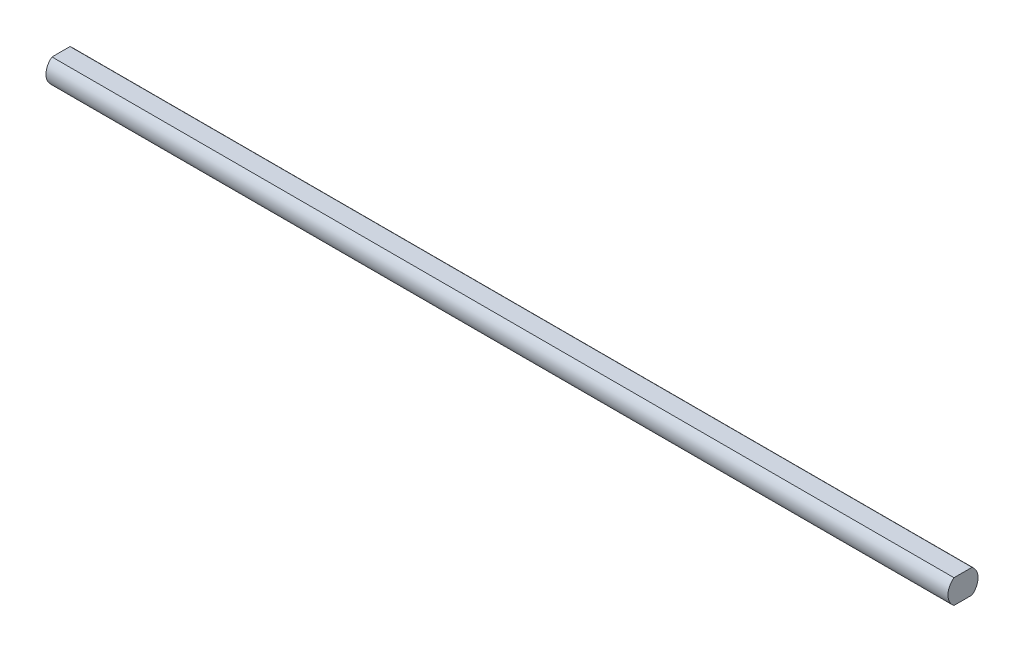
ISO-10303-21;
HEADER;
FILE_DESCRIPTION(('STEP AP214'),'2;1');
FILE_NAME('part.step','',(''),(''),'','','');
FILE_SCHEMA(('AUTOMOTIVE_DESIGN { 1 0 10303 214 1 1 1 1 }'));
ENDSEC;
DATA;
#1=APPLICATION_CONTEXT('core data for automotive mechanical design processes');
#2=APPLICATION_PROTOCOL_DEFINITION('international standard','automotive_design',2000,#1);
#3=PRODUCT_CONTEXT('',#1,'mechanical');
#4=PRODUCT('Part','Part','',(#3));
#5=PRODUCT_RELATED_PRODUCT_CATEGORY('part','',(#4));
#6=PRODUCT_DEFINITION_FORMATION('','',#4);
#7=PRODUCT_DEFINITION_CONTEXT('part definition',#1,'design');
#8=PRODUCT_DEFINITION('design','',#6,#7);
#9=PRODUCT_DEFINITION_SHAPE('','',#8);
#10=(LENGTH_UNIT() NAMED_UNIT(*) SI_UNIT(.MILLI.,.METRE.));
#11=(NAMED_UNIT(*) PLANE_ANGLE_UNIT() SI_UNIT($,.RADIAN.));
#12=(NAMED_UNIT(*) SI_UNIT($,.STERADIAN.) SOLID_ANGLE_UNIT());
#13=UNCERTAINTY_MEASURE_WITH_UNIT(LENGTH_MEASURE(1.E-05),#10,'distance_accuracy_value','');
#14=(GEOMETRIC_REPRESENTATION_CONTEXT(3) GLOBAL_UNCERTAINTY_ASSIGNED_CONTEXT((#13)) GLOBAL_UNIT_ASSIGNED_CONTEXT((#10,
#11,#12)) REPRESENTATION_CONTEXT('',''));
#15=CARTESIAN_POINT('',(0.,0.,0.));
#16=DIRECTION('',(0.,0.,1.));
#17=DIRECTION('',(1.,0.,0.));
#18=AXIS2_PLACEMENT_3D('',#15,#16,#17);
#19=CARTESIAN_POINT('',(-150.,-5.,0.));
#20=DIRECTION('',(-1.,0.,0.));
#21=DIRECTION('',(0.,0.,1.));
#22=AXIS2_PLACEMENT_3D('',#19,#20,#21);
#23=PLANE('',#22);
#24=CARTESIAN_POINT('',(-150.,0.,0.));
#25=DIRECTION('',(-1.,0.,0.));
#26=DIRECTION('',(0.,0.,1.));
#27=AXIS2_PLACEMENT_3D('',#24,#25,#26);
#28=CIRCLE('',#27,5.);
#29=CARTESIAN_POINT('',(-150.,4.,-3.));
#30=VERTEX_POINT('',#29);
#31=CARTESIAN_POINT('',(-150.,-4.00000000000002,-2.99999999999998));
#32=VERTEX_POINT('',#31);
#33=EDGE_CURVE('E106',#30,#32,#28,.T.);
#34=ORIENTED_EDGE('',*,*,#33,.T.);
#35=DIRECTION('',(0.,0.,-1.));
#36=VECTOR('',#35,1.);
#37=CARTESIAN_POINT('',(-150.,-4.00000000000002,0.));
#38=LINE('',#37,#36);
#39=CARTESIAN_POINT('',(-150.,-4.00000000000002,2.99999999999998));
#40=VERTEX_POINT('',#39);
#41=EDGE_CURVE('E62',#40,#32,#38,.T.);
#42=ORIENTED_EDGE('',*,*,#41,.F.);
#43=CARTESIAN_POINT('',(-150.,4.,3.));
#44=VERTEX_POINT('',#43);
#45=EDGE_CURVE('E102',#40,#44,#28,.T.);
#46=ORIENTED_EDGE('',*,*,#45,.T.);
#47=DIRECTION('',(0.,0.,-1.));
#48=VECTOR('',#47,1.);
#49=CARTESIAN_POINT('',(-150.,4.,3.));
#50=LINE('',#49,#48);
#51=EDGE_CURVE('E109',#44,#30,#50,.T.);
#52=ORIENTED_EDGE('',*,*,#51,.T.);
#53=EDGE_LOOP('',(#34,#42,#46,#52));
#54=FACE_BOUND('',#53,.T.);
#55=ADVANCED_FACE('F47',(#54),#23,.T.);
#56=CARTESIAN_POINT('',(150.,0.,0.));
#57=DIRECTION('',(1.,0.,0.));
#58=DIRECTION('',(0.,0.,-1.));
#59=AXIS2_PLACEMENT_3D('',#56,#57,#58);
#60=PLANE('',#59);
#61=CARTESIAN_POINT('',(150.,0.,0.));
#62=DIRECTION('',(-1.,0.,0.));
#63=DIRECTION('',(0.,0.,1.));
#64=AXIS2_PLACEMENT_3D('',#61,#62,#63);
#65=CIRCLE('',#64,5.);
#66=CARTESIAN_POINT('',(150.,-4.00000000000002,2.99999999999998));
#67=VERTEX_POINT('',#66);
#68=CARTESIAN_POINT('',(150.,4.,3.));
#69=VERTEX_POINT('',#68);
#70=EDGE_CURVE('E50',#67,#69,#65,.T.);
#71=ORIENTED_EDGE('',*,*,#70,.F.);
#72=DIRECTION('',(0.,0.,-1.));
#73=VECTOR('',#72,1.);
#74=CARTESIAN_POINT('',(150.,-4.00000000000002,0.));
#75=LINE('',#74,#73);
#76=CARTESIAN_POINT('',(150.,-4.00000000000002,-2.99999999999998));
#77=VERTEX_POINT('',#76);
#78=EDGE_CURVE('E88',#67,#77,#75,.T.);
#79=ORIENTED_EDGE('',*,*,#78,.T.);
#80=CARTESIAN_POINT('',(150.,4.,-3.));
#81=VERTEX_POINT('',#80);
#82=EDGE_CURVE('E11',#81,#77,#65,.T.);
#83=ORIENTED_EDGE('',*,*,#82,.F.);
#84=DIRECTION('',(0.,0.,-1.));
#85=VECTOR('',#84,1.);
#86=CARTESIAN_POINT('',(150.,4.,3.));
#87=LINE('',#86,#85);
#88=EDGE_CURVE('E70',#69,#81,#87,.T.);
#89=ORIENTED_EDGE('',*,*,#88,.F.);
#90=EDGE_LOOP('',(#71,#79,#83,#89));
#91=FACE_BOUND('',#90,.T.);
#92=ADVANCED_FACE('F99',(#91),#60,.T.);
#93=CARTESIAN_POINT('',(-150.,0.,0.));
#94=DIRECTION('',(-1.,0.,0.));
#95=DIRECTION('',(0.,0.,1.));
#96=AXIS2_PLACEMENT_3D('',#93,#94,#95);
#97=CYLINDRICAL_SURFACE('',#96,5.);
#98=ORIENTED_EDGE('',*,*,#45,.F.);
#99=DIRECTION('',(1.,0.,0.));
#100=VECTOR('',#99,1.);
#101=CARTESIAN_POINT('',(-156.082762530298,-4.00000000000002,2.99999999999998));
#102=LINE('',#101,#100);
#103=EDGE_CURVE('E94',#40,#67,#102,.T.);
#104=ORIENTED_EDGE('',*,*,#103,.T.);
#105=ORIENTED_EDGE('',*,*,#70,.T.);
#106=DIRECTION('',(1.,0.,0.));
#107=VECTOR('',#106,1.);
#108=CARTESIAN_POINT('',(-156.082762530298,4.,3.));
#109=LINE('',#108,#107);
#110=EDGE_CURVE('E110',#44,#69,#109,.T.);
#111=ORIENTED_EDGE('',*,*,#110,.F.);
#112=EDGE_LOOP('',(#98,#104,#105,#111));
#113=FACE_BOUND('',#112,.T.);
#114=ADVANCED_FACE('F127',(#113),#97,.T.);
#115=ORIENTED_EDGE('',*,*,#82,.T.);
#116=DIRECTION('',(1.,0.,0.));
#117=VECTOR('',#116,1.);
#118=CARTESIAN_POINT('',(-156.082762530298,-4.00000000000002,-2.99999999999998));
#119=LINE('',#118,#117);
#120=EDGE_CURVE('E85',#32,#77,#119,.T.);
#121=ORIENTED_EDGE('',*,*,#120,.F.);
#122=ORIENTED_EDGE('',*,*,#33,.F.);
#123=DIRECTION('',(1.,0.,0.));
#124=VECTOR('',#123,1.);
#125=CARTESIAN_POINT('',(-156.082762530298,4.,-3.));
#126=LINE('',#125,#124);
#127=EDGE_CURVE('E105',#30,#81,#126,.T.);
#128=ORIENTED_EDGE('',*,*,#127,.T.);
#129=EDGE_LOOP('',(#115,#121,#122,#128));
#130=FACE_BOUND('',#129,.T.);
#131=ADVANCED_FACE('F104',(#130),#97,.T.);
#132=CARTESIAN_POINT('',(-156.082762530298,4.,3.));
#133=DIRECTION('',(0.,-1.,0.));
#134=DIRECTION('',(0.,0.,-1.));
#135=AXIS2_PLACEMENT_3D('',#132,#133,#134);
#136=PLANE('',#135);
#137=ORIENTED_EDGE('',*,*,#110,.T.);
#138=ORIENTED_EDGE('',*,*,#88,.T.);
#139=ORIENTED_EDGE('',*,*,#127,.F.);
#140=ORIENTED_EDGE('',*,*,#51,.F.);
#141=EDGE_LOOP('',(#137,#138,#139,#140));
#142=FACE_BOUND('',#141,.T.);
#143=ADVANCED_FACE('F140',(#142),#136,.F.);
#144=CARTESIAN_POINT('',(-156.082762530298,-4.00000000000002,0.));
#145=DIRECTION('',(0.,-1.,0.));
#146=DIRECTION('',(0.,0.,-1.));
#147=AXIS2_PLACEMENT_3D('',#144,#145,#146);
#148=PLANE('',#147);
#149=ORIENTED_EDGE('',*,*,#41,.T.);
#150=ORIENTED_EDGE('',*,*,#120,.T.);
#151=ORIENTED_EDGE('',*,*,#78,.F.);
#152=ORIENTED_EDGE('',*,*,#103,.F.);
#153=EDGE_LOOP('',(#149,#150,#151,#152));
#154=FACE_BOUND('',#153,.T.);
#155=ADVANCED_FACE('F87',(#154),#148,.T.);
#156=CLOSED_SHELL('',(#55,#92,#114,#131,#143,#155));
#157=MANIFOLD_SOLID_BREP('B2',#156);
#158=ADVANCED_BREP_SHAPE_REPRESENTATION('',(#18,#157),#14);
#159=SHAPE_DEFINITION_REPRESENTATION(#9,#158);
ENDSEC;
END-ISO-10303-21;
